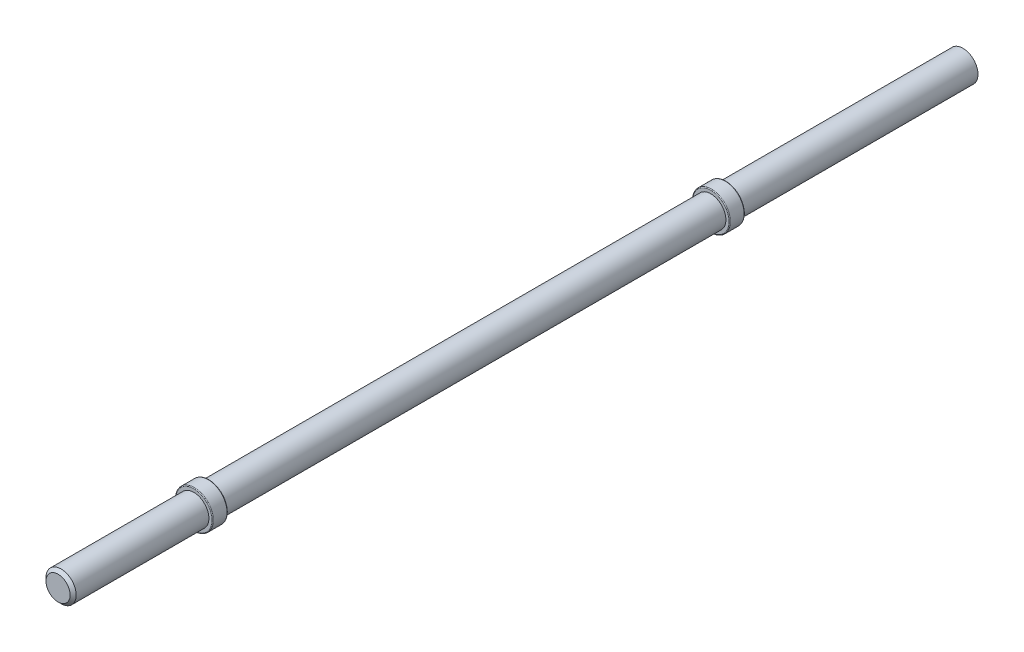
ISO-10303-21;
HEADER;
FILE_DESCRIPTION(('STEP AP214'),'2;1');
FILE_NAME('part.step','',(''),(''),'','','');
FILE_SCHEMA(('AUTOMOTIVE_DESIGN { 1 0 10303 214 1 1 1 1 }'));
ENDSEC;
DATA;
#1=APPLICATION_CONTEXT('core data for automotive mechanical design processes');
#2=APPLICATION_PROTOCOL_DEFINITION('international standard','automotive_design',2000,#1);
#3=PRODUCT_CONTEXT('',#1,'mechanical');
#4=PRODUCT('Part','Part','',(#3));
#5=PRODUCT_RELATED_PRODUCT_CATEGORY('part','',(#4));
#6=PRODUCT_DEFINITION_FORMATION('','',#4);
#7=PRODUCT_DEFINITION_CONTEXT('part definition',#1,'design');
#8=PRODUCT_DEFINITION('design','',#6,#7);
#9=PRODUCT_DEFINITION_SHAPE('','',#8);
#10=(LENGTH_UNIT() NAMED_UNIT(*) SI_UNIT(.MILLI.,.METRE.));
#11=(NAMED_UNIT(*) PLANE_ANGLE_UNIT() SI_UNIT($,.RADIAN.));
#12=(NAMED_UNIT(*) SI_UNIT($,.STERADIAN.) SOLID_ANGLE_UNIT());
#13=UNCERTAINTY_MEASURE_WITH_UNIT(LENGTH_MEASURE(1.E-05),#10,'distance_accuracy_value','');
#14=(GEOMETRIC_REPRESENTATION_CONTEXT(3) GLOBAL_UNCERTAINTY_ASSIGNED_CONTEXT((#13)) GLOBAL_UNIT_ASSIGNED_CONTEXT((#10,
#11,#12)) REPRESENTATION_CONTEXT('',''));
#15=CARTESIAN_POINT('',(0.,0.,0.));
#16=DIRECTION('',(0.,0.,1.));
#17=DIRECTION('',(1.,0.,0.));
#18=AXIS2_PLACEMENT_3D('',#15,#16,#17);
#19=CARTESIAN_POINT('',(0.,0.,0.));
#20=DIRECTION('',(0.,0.,-1.));
#21=DIRECTION('',(-1.,0.,0.));
#22=AXIS2_PLACEMENT_3D('',#19,#20,#21);
#23=CYLINDRICAL_SURFACE('',#22,10.);
#24=CARTESIAN_POINT('',(0.,0.,200.));
#25=DIRECTION('',(0.,0.,-1.));
#26=DIRECTION('',(-1.,0.,0.));
#27=AXIS2_PLACEMENT_3D('',#24,#25,#26);
#28=CIRCLE('',#27,10.);
#29=CARTESIAN_POINT('',(10.,0.,200.));
#30=VERTEX_POINT('',#29);
#31=EDGE_CURVE('E95',#30,#30,#28,.T.);
#32=ORIENTED_EDGE('',*,*,#31,.T.);
#33=EDGE_LOOP('',(#32));
#34=FACE_BOUND('',#33,.T.);
#35=CARTESIAN_POINT('',(0.,0.,-132.84));
#36=DIRECTION('',(0.,0.,-1.));
#37=DIRECTION('',(-1.,0.,0.));
#38=AXIS2_PLACEMENT_3D('',#35,#36,#37);
#39=CIRCLE('',#38,10.);
#40=CARTESIAN_POINT('',(-10.,0.,-132.84));
#41=VERTEX_POINT('',#40);
#42=EDGE_CURVE('E98',#41,#41,#39,.F.);
#43=ORIENTED_EDGE('',*,*,#42,.T.);
#44=EDGE_LOOP('',(#43));
#45=FACE_BOUND('',#44,.T.);
#46=ADVANCED_FACE('F40',(#34,#45),#23,.T.);
#47=CARTESIAN_POINT('',(0.,0.,299.));
#48=DIRECTION('',(0.,0.,-1.));
#49=DIRECTION('',(-1.,0.,0.));
#50=AXIS2_PLACEMENT_3D('',#47,#48,#49);
#51=CONICAL_SURFACE('',#50,9.,0.78539816339745);
#52=CARTESIAN_POINT('',(0.,0.,298.));
#53=DIRECTION('',(0.,0.,1.));
#54=DIRECTION('',(-1.,0.,0.));
#55=AXIS2_PLACEMENT_3D('',#52,#53,#54);
#56=CIRCLE('',#55,10.);
#57=CARTESIAN_POINT('',(10.,0.,298.));
#58=VERTEX_POINT('',#57);
#59=EDGE_CURVE('E55',#58,#58,#56,.T.);
#60=ORIENTED_EDGE('',*,*,#59,.T.);
#61=EDGE_LOOP('',(#60));
#62=FACE_BOUND('',#61,.T.);
#63=CARTESIAN_POINT('',(0.,0.,300.));
#64=DIRECTION('',(0.,0.,-1.));
#65=DIRECTION('',(-1.,0.,0.));
#66=AXIS2_PLACEMENT_3D('',#63,#64,#65);
#67=CIRCLE('',#66,8.);
#68=CARTESIAN_POINT('',(8.,0.,300.));
#69=VERTEX_POINT('',#68);
#70=EDGE_CURVE('E86',#69,#69,#67,.T.);
#71=ORIENTED_EDGE('',*,*,#70,.T.);
#72=EDGE_LOOP('',(#71));
#73=FACE_BOUND('',#72,.T.);
#74=ADVANCED_FACE('F165',(#62,#73),#51,.T.);
#75=CARTESIAN_POINT('',(0.,0.,0.));
#76=DIRECTION('',(0.,0.,-1.));
#77=DIRECTION('',(-1.,0.,0.));
#78=AXIS2_PLACEMENT_3D('',#75,#76,#77);
#79=CYLINDRICAL_SURFACE('',#78,10.);
#80=CARTESIAN_POINT('',(0.,0.,210.));
#81=DIRECTION('',(0.,0.,1.));
#82=DIRECTION('',(-1.,0.,0.));
#83=AXIS2_PLACEMENT_3D('',#80,#81,#82);
#84=CIRCLE('',#83,10.);
#85=CARTESIAN_POINT('',(10.,0.,210.));
#86=VERTEX_POINT('',#85);
#87=EDGE_CURVE('E77',#86,#86,#84,.T.);
#88=ORIENTED_EDGE('',*,*,#87,.T.);
#89=EDGE_LOOP('',(#88));
#90=FACE_BOUND('',#89,.T.);
#91=ORIENTED_EDGE('',*,*,#59,.F.);
#92=EDGE_LOOP('',(#91));
#93=FACE_BOUND('',#92,.T.);
#94=ADVANCED_FACE('F170',(#90,#93),#79,.T.);
#95=CARTESIAN_POINT('',(0.,0.,300.));
#96=DIRECTION('',(0.,0.,1.));
#97=DIRECTION('',(1.,0.,0.));
#98=AXIS2_PLACEMENT_3D('',#95,#96,#97);
#99=PLANE('',#98);
#100=ORIENTED_EDGE('',*,*,#70,.F.);
#101=EDGE_LOOP('',(#100));
#102=FACE_BOUND('',#101,.T.);
#103=ADVANCED_FACE('F182',(#102),#99,.T.);
#104=CARTESIAN_POINT('',(0.,0.,200.5));
#105=DIRECTION('',(0.,0.,-1.));
#106=DIRECTION('',(-1.,0.,0.));
#107=AXIS2_PLACEMENT_3D('',#104,#105,#106);
#108=TOROIDAL_SURFACE('',#107,12.,0.5);
#109=CARTESIAN_POINT('',(0.,0.,200.5));
#110=DIRECTION('',(0.,0.,-1.));
#111=DIRECTION('',(-1.,0.,0.));
#112=AXIS2_PLACEMENT_3D('',#109,#110,#111);
#113=CIRCLE('',#112,12.5);
#114=CARTESIAN_POINT('',(12.5,0.,200.5));
#115=VERTEX_POINT('',#114);
#116=EDGE_CURVE('E81',#115,#115,#113,.T.);
#117=ORIENTED_EDGE('',*,*,#116,.T.);
#118=EDGE_LOOP('',(#117));
#119=FACE_BOUND('',#118,.T.);
#120=CARTESIAN_POINT('',(0.,0.,200.));
#121=DIRECTION('',(0.,0.,1.));
#122=DIRECTION('',(-1.,0.,0.));
#123=AXIS2_PLACEMENT_3D('',#120,#121,#122);
#124=CIRCLE('',#123,12.);
#125=CARTESIAN_POINT('',(12.,0.,200.));
#126=VERTEX_POINT('',#125);
#127=EDGE_CURVE('E84',#126,#126,#124,.T.);
#128=ORIENTED_EDGE('',*,*,#127,.T.);
#129=EDGE_LOOP('',(#128));
#130=FACE_BOUND('',#129,.T.);
#131=ADVANCED_FACE('F177',(#119,#130),#108,.T.);
#132=CARTESIAN_POINT('',(0.,0.,210.));
#133=DIRECTION('',(0.,0.,1.));
#134=DIRECTION('',(-1.,0.,0.));
#135=AXIS2_PLACEMENT_3D('',#132,#133,#134);
#136=CYLINDRICAL_SURFACE('',#135,12.5);
#137=CARTESIAN_POINT('',(0.,0.,209.5));
#138=DIRECTION('',(0.,0.,1.));
#139=DIRECTION('',(-1.,0.,0.));
#140=AXIS2_PLACEMENT_3D('',#137,#138,#139);
#141=CIRCLE('',#140,12.5);
#142=CARTESIAN_POINT('',(12.5,0.,209.5));
#143=VERTEX_POINT('',#142);
#144=EDGE_CURVE('E101',#143,#143,#141,.T.);
#145=ORIENTED_EDGE('',*,*,#144,.F.);
#146=EDGE_LOOP('',(#145));
#147=FACE_BOUND('',#146,.T.);
#148=ORIENTED_EDGE('',*,*,#116,.F.);
#149=EDGE_LOOP('',(#148));
#150=FACE_BOUND('',#149,.T.);
#151=ADVANCED_FACE('F82',(#147,#150),#136,.T.);
#152=CARTESIAN_POINT('',(0.,0.,200.));
#153=DIRECTION('',(0.,0.,1.));
#154=DIRECTION('',(1.,0.,0.));
#155=AXIS2_PLACEMENT_3D('',#152,#153,#154);
#156=PLANE('',#155);
#157=ORIENTED_EDGE('',*,*,#31,.F.);
#158=EDGE_LOOP('',(#157));
#159=FACE_BOUND('',#158,.T.);
#160=ORIENTED_EDGE('',*,*,#127,.F.);
#161=EDGE_LOOP('',(#160));
#162=FACE_BOUND('',#161,.T.);
#163=ADVANCED_FACE('F157',(#159,#162),#156,.F.);
#164=CARTESIAN_POINT('',(0.,0.,209.5));
#165=DIRECTION('',(0.,0.,-1.));
#166=DIRECTION('',(-1.,0.,0.));
#167=AXIS2_PLACEMENT_3D('',#164,#165,#166);
#168=TOROIDAL_SURFACE('',#167,12.,0.5);
#169=CARTESIAN_POINT('',(0.,0.,210.));
#170=DIRECTION('',(0.,0.,-1.));
#171=DIRECTION('',(-1.,0.,0.));
#172=AXIS2_PLACEMENT_3D('',#169,#170,#171);
#173=CIRCLE('',#172,12.);
#174=CARTESIAN_POINT('',(12.,0.,210.));
#175=VERTEX_POINT('',#174);
#176=EDGE_CURVE('E89',#175,#175,#173,.T.);
#177=ORIENTED_EDGE('',*,*,#176,.T.);
#178=EDGE_LOOP('',(#177));
#179=FACE_BOUND('',#178,.T.);
#180=ORIENTED_EDGE('',*,*,#144,.T.);
#181=EDGE_LOOP('',(#180));
#182=FACE_BOUND('',#181,.T.);
#183=ADVANCED_FACE('F152',(#179,#182),#168,.T.);
#184=CARTESIAN_POINT('',(0.,0.,210.));
#185=DIRECTION('',(0.,0.,1.));
#186=DIRECTION('',(1.,0.,0.));
#187=AXIS2_PLACEMENT_3D('',#184,#185,#186);
#188=PLANE('',#187);
#189=ORIENTED_EDGE('',*,*,#87,.F.);
#190=EDGE_LOOP('',(#189));
#191=FACE_BOUND('',#190,.T.);
#192=ORIENTED_EDGE('',*,*,#176,.F.);
#193=EDGE_LOOP('',(#192));
#194=FACE_BOUND('',#193,.T.);
#195=ADVANCED_FACE('F130',(#191,#194),#188,.T.);
#196=CARTESIAN_POINT('',(-9.97446388880706E-13,0.,-142.84));
#197=DIRECTION('',(0.,0.,1.));
#198=DIRECTION('',(1.,0.,0.));
#199=AXIS2_PLACEMENT_3D('',#196,#197,#198);
#200=CYLINDRICAL_SURFACE('',#199,12.5000000000007);
#201=CARTESIAN_POINT('',(-9.31108243442687E-13,0.,-133.34));
#202=DIRECTION('',(0.,0.,-1.));
#203=DIRECTION('',(-1.,0.,0.));
#204=AXIS2_PLACEMENT_3D('',#201,#202,#203);
#205=CIRCLE('',#204,12.5000000000007);
#206=CARTESIAN_POINT('',(-12.5000000000016,0.,-133.34));
#207=VERTEX_POINT('',#206);
#208=EDGE_CURVE('E112',#207,#207,#205,.T.);
#209=ORIENTED_EDGE('',*,*,#208,.T.);
#210=EDGE_LOOP('',(#209));
#211=FACE_BOUND('',#210,.T.);
#212=CARTESIAN_POINT('',(-9.93954907541863E-13,0.,-142.34));
#213=DIRECTION('',(0.,0.,-1.));
#214=DIRECTION('',(-1.,0.,0.));
#215=AXIS2_PLACEMENT_3D('',#212,#213,#214);
#216=CIRCLE('',#215,12.5000000000007);
#217=CARTESIAN_POINT('',(-12.5000000000017,0.,-142.34));
#218=VERTEX_POINT('',#217);
#219=EDGE_CURVE('E109',#218,#218,#216,.F.);
#220=ORIENTED_EDGE('',*,*,#219,.T.);
#221=EDGE_LOOP('',(#220));
#222=FACE_BOUND('',#221,.T.);
#223=ADVANCED_FACE('F126',(#211,#222),#200,.T.);
#224=CARTESIAN_POINT('',(-9.97446388880706E-13,0.,-142.84));
#225=DIRECTION('',(0.,0.,-1.));
#226=DIRECTION('',(-1.,0.,0.));
#227=AXIS2_PLACEMENT_3D('',#224,#225,#226);
#228=PLANE('',#227);
#229=CARTESIAN_POINT('',(-9.97446388880706E-13,0.,-142.84));
#230=DIRECTION('',(0.,0.,-1.));
#231=DIRECTION('',(-1.,0.,0.));
#232=AXIS2_PLACEMENT_3D('',#229,#230,#231);
#233=CIRCLE('',#232,12.0000000000007);
#234=CARTESIAN_POINT('',(-12.0000000000017,0.,-142.84));
#235=VERTEX_POINT('',#234);
#236=EDGE_CURVE('E11',#235,#235,#233,.T.);
#237=ORIENTED_EDGE('',*,*,#236,.T.);
#238=EDGE_LOOP('',(#237));
#239=FACE_BOUND('',#238,.T.);
#240=CARTESIAN_POINT('',(0.,0.,-142.84));
#241=DIRECTION('',(0.,0.,-1.));
#242=DIRECTION('',(-1.,0.,0.));
#243=AXIS2_PLACEMENT_3D('',#240,#241,#242);
#244=CIRCLE('',#243,10.);
#245=CARTESIAN_POINT('',(-10.,0.,-142.84));
#246=VERTEX_POINT('',#245);
#247=EDGE_CURVE('E106',#246,#246,#244,.F.);
#248=ORIENTED_EDGE('',*,*,#247,.T.);
#249=EDGE_LOOP('',(#248));
#250=FACE_BOUND('',#249,.T.);
#251=ADVANCED_FACE('F129',(#239,#250),#228,.T.);
#252=CARTESIAN_POINT('',(-9.27616762103844E-13,0.,-132.84));
#253=DIRECTION('',(0.,0.,-1.));
#254=DIRECTION('',(-1.,0.,0.));
#255=AXIS2_PLACEMENT_3D('',#252,#253,#254);
#256=PLANE('',#255);
#257=CARTESIAN_POINT('',(-9.27616762103844E-13,0.,-132.84));
#258=DIRECTION('',(0.,0.,-1.));
#259=DIRECTION('',(-1.,0.,0.));
#260=AXIS2_PLACEMENT_3D('',#257,#258,#259);
#261=CIRCLE('',#260,12.0000000000007);
#262=CARTESIAN_POINT('',(-12.0000000000016,0.,-132.84));
#263=VERTEX_POINT('',#262);
#264=EDGE_CURVE('E49',#263,#263,#261,.F.);
#265=ORIENTED_EDGE('',*,*,#264,.T.);
#266=EDGE_LOOP('',(#265));
#267=FACE_BOUND('',#266,.T.);
#268=ORIENTED_EDGE('',*,*,#42,.F.);
#269=EDGE_LOOP('',(#268));
#270=FACE_BOUND('',#269,.T.);
#271=ADVANCED_FACE('F117',(#267,#270),#256,.F.);
#272=CARTESIAN_POINT('',(0.,0.,-300.));
#273=DIRECTION('',(0.,0.,1.));
#274=DIRECTION('',(1.,0.,0.));
#275=AXIS2_PLACEMENT_3D('',#272,#273,#274);
#276=PLANE('',#275);
#277=CARTESIAN_POINT('',(0.,0.,-300.));
#278=DIRECTION('',(0.,0.,-1.));
#279=DIRECTION('',(-1.,0.,0.));
#280=AXIS2_PLACEMENT_3D('',#277,#278,#279);
#281=CIRCLE('',#280,10.);
#282=CARTESIAN_POINT('',(10.,0.,-300.));
#283=VERTEX_POINT('',#282);
#284=EDGE_CURVE('E92',#283,#283,#281,.T.);
#285=ORIENTED_EDGE('',*,*,#284,.T.);
#286=EDGE_LOOP('',(#285));
#287=FACE_BOUND('',#286,.T.);
#288=ADVANCED_FACE('F145',(#287),#276,.F.);
#289=ORIENTED_EDGE('',*,*,#247,.F.);
#290=EDGE_LOOP('',(#289));
#291=FACE_BOUND('',#290,.T.);
#292=ORIENTED_EDGE('',*,*,#284,.F.);
#293=EDGE_LOOP('',(#292));
#294=FACE_BOUND('',#293,.T.);
#295=ADVANCED_FACE('F123',(#291,#294),#23,.T.);
#296=CARTESIAN_POINT('',(-9.31108243442687E-13,0.,-133.34));
#297=DIRECTION('',(0.,0.,-1.));
#298=DIRECTION('',(-1.,0.,0.));
#299=AXIS2_PLACEMENT_3D('',#296,#297,#298);
#300=TOROIDAL_SURFACE('',#299,12.0000000000007,0.5);
#301=ORIENTED_EDGE('',*,*,#264,.F.);
#302=EDGE_LOOP('',(#301));
#303=FACE_BOUND('',#302,.T.);
#304=ORIENTED_EDGE('',*,*,#208,.F.);
#305=EDGE_LOOP('',(#304));
#306=FACE_BOUND('',#305,.T.);
#307=ADVANCED_FACE('F120',(#303,#306),#300,.T.);
#308=CARTESIAN_POINT('',(-9.93954907541863E-13,0.,-142.34));
#309=DIRECTION('',(0.,0.,-1.));
#310=DIRECTION('',(-1.,0.,0.));
#311=AXIS2_PLACEMENT_3D('',#308,#309,#310);
#312=TOROIDAL_SURFACE('',#311,12.0000000000007,0.5);
#313=ORIENTED_EDGE('',*,*,#219,.F.);
#314=EDGE_LOOP('',(#313));
#315=FACE_BOUND('',#314,.T.);
#316=ORIENTED_EDGE('',*,*,#236,.F.);
#317=EDGE_LOOP('',(#316));
#318=FACE_BOUND('',#317,.T.);
#319=ADVANCED_FACE('F42',(#315,#318),#312,.T.);
#320=CLOSED_SHELL('',(#46,#74,#94,#103,#131,#151,#163,#183,#195,#223,#251,#271,#288,#295,#307,#319));
#321=MANIFOLD_SOLID_BREP('B2',#320);
#322=ADVANCED_BREP_SHAPE_REPRESENTATION('',(#18,#321),#14);
#323=SHAPE_DEFINITION_REPRESENTATION(#9,#322);
ENDSEC;
END-ISO-10303-21;
